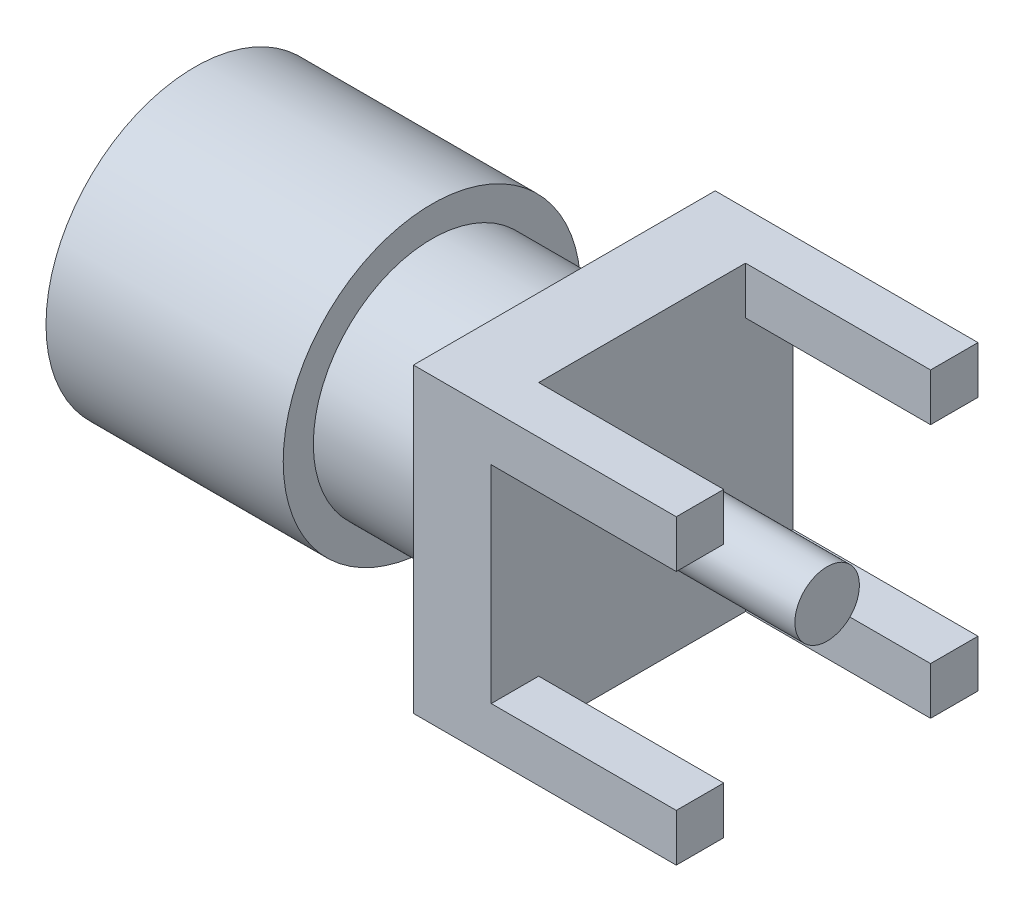
ISO-10303-21;
HEADER;
FILE_DESCRIPTION(('STEP AP214'),'2;1');
FILE_NAME('part.step','',(''),(''),'','','');
FILE_SCHEMA(('AUTOMOTIVE_DESIGN { 1 0 10303 214 1 1 1 1 }'));
ENDSEC;
DATA;
#1=APPLICATION_CONTEXT('core data for automotive mechanical design processes');
#2=APPLICATION_PROTOCOL_DEFINITION('international standard','automotive_design',2000,#1);
#3=PRODUCT_CONTEXT('',#1,'mechanical');
#4=PRODUCT('Part','Part','',(#3));
#5=PRODUCT_RELATED_PRODUCT_CATEGORY('part','',(#4));
#6=PRODUCT_DEFINITION_FORMATION('','',#4);
#7=PRODUCT_DEFINITION_CONTEXT('part definition',#1,'design');
#8=PRODUCT_DEFINITION('design','',#6,#7);
#9=PRODUCT_DEFINITION_SHAPE('','',#8);
#10=(LENGTH_UNIT() NAMED_UNIT(*) SI_UNIT(.MILLI.,.METRE.));
#11=(NAMED_UNIT(*) PLANE_ANGLE_UNIT() SI_UNIT($,.RADIAN.));
#12=(NAMED_UNIT(*) SI_UNIT($,.STERADIAN.) SOLID_ANGLE_UNIT());
#13=UNCERTAINTY_MEASURE_WITH_UNIT(LENGTH_MEASURE(1.E-05),#10,'distance_accuracy_value','');
#14=(GEOMETRIC_REPRESENTATION_CONTEXT(3) GLOBAL_UNCERTAINTY_ASSIGNED_CONTEXT((#13)) GLOBAL_UNIT_ASSIGNED_CONTEXT((#10,
#11,#12)) REPRESENTATION_CONTEXT('',''));
#15=CARTESIAN_POINT('',(0.,0.,0.));
#16=DIRECTION('',(0.,0.,1.));
#17=DIRECTION('',(1.,0.,0.));
#18=AXIS2_PLACEMENT_3D('',#15,#16,#17);
#19=CARTESIAN_POINT('',(0.82,3.18000000000001,-3.18));
#20=DIRECTION('',(1.,0.,0.));
#21=DIRECTION('',(0.,0.,-1.));
#22=AXIS2_PLACEMENT_3D('',#19,#20,#21);
#23=PLANE('',#22);
#24=DIRECTION('',(0.,-1.,0.));
#25=VECTOR('',#24,1.);
#26=CARTESIAN_POINT('',(0.82,-3.18,-2.18));
#27=LINE('',#26,#25);
#28=CARTESIAN_POINT('',(0.82,-2.18,-2.18));
#29=VERTEX_POINT('',#28);
#30=CARTESIAN_POINT('',(0.82,-3.18,-2.18));
#31=VERTEX_POINT('',#30);
#32=EDGE_CURVE('E51',#29,#31,#27,.T.);
#33=ORIENTED_EDGE('',*,*,#32,.F.);
#34=DIRECTION('',(0.,0.,1.));
#35=VECTOR('',#34,1.);
#36=CARTESIAN_POINT('',(0.82,-2.18,-3.18));
#37=LINE('',#36,#35);
#38=CARTESIAN_POINT('',(0.82,-2.18,-3.18));
#39=VERTEX_POINT('',#38);
#40=EDGE_CURVE('E435',#39,#29,#37,.T.);
#41=ORIENTED_EDGE('',*,*,#40,.F.);
#42=DIRECTION('',(0.,1.,0.));
#43=VECTOR('',#42,1.);
#44=CARTESIAN_POINT('',(0.82,3.18000000000001,-3.18));
#45=LINE('',#44,#43);
#46=CARTESIAN_POINT('',(0.82,2.18000000000001,-3.18));
#47=VERTEX_POINT('',#46);
#48=EDGE_CURVE('E168',#39,#47,#45,.T.);
#49=ORIENTED_EDGE('',*,*,#48,.T.);
#50=DIRECTION('',(0.,0.,-1.));
#51=VECTOR('',#50,1.);
#52=CARTESIAN_POINT('',(0.82,2.18000000000001,-3.18));
#53=LINE('',#52,#51);
#54=CARTESIAN_POINT('',(0.82,2.18000000000001,-2.18));
#55=VERTEX_POINT('',#54);
#56=EDGE_CURVE('E201',#55,#47,#53,.T.);
#57=ORIENTED_EDGE('',*,*,#56,.F.);
#58=DIRECTION('',(0.,-1.,0.));
#59=VECTOR('',#58,1.);
#60=CARTESIAN_POINT('',(0.82,3.18000000000001,-2.18));
#61=LINE('',#60,#59);
#62=CARTESIAN_POINT('',(0.82,3.18000000000001,-2.18));
#63=VERTEX_POINT('',#62);
#64=EDGE_CURVE('E196',#63,#55,#61,.T.);
#65=ORIENTED_EDGE('',*,*,#64,.F.);
#66=DIRECTION('',(0.,0.,1.));
#67=VECTOR('',#66,1.);
#68=CARTESIAN_POINT('',(0.82,3.18000000000001,-3.18));
#69=LINE('',#68,#67);
#70=CARTESIAN_POINT('',(0.82,3.18000000000001,2.18));
#71=VERTEX_POINT('',#70);
#72=EDGE_CURVE('E245',#63,#71,#69,.T.);
#73=ORIENTED_EDGE('',*,*,#72,.T.);
#74=DIRECTION('',(0.,1.,0.));
#75=VECTOR('',#74,1.);
#76=CARTESIAN_POINT('',(0.82,3.18000000000001,2.18));
#77=LINE('',#76,#75);
#78=CARTESIAN_POINT('',(0.82,2.18000000000001,2.18));
#79=VERTEX_POINT('',#78);
#80=EDGE_CURVE('E224',#79,#71,#77,.T.);
#81=ORIENTED_EDGE('',*,*,#80,.F.);
#82=DIRECTION('',(0.,0.,-1.));
#83=VECTOR('',#82,1.);
#84=CARTESIAN_POINT('',(0.82,2.18000000000001,3.18));
#85=LINE('',#84,#83);
#86=CARTESIAN_POINT('',(0.82,2.18000000000001,3.18));
#87=VERTEX_POINT('',#86);
#88=EDGE_CURVE('E219',#87,#79,#85,.T.);
#89=ORIENTED_EDGE('',*,*,#88,.F.);
#90=DIRECTION('',(0.,1.,0.));
#91=VECTOR('',#90,1.);
#92=CARTESIAN_POINT('',(0.82,3.18000000000001,3.18));
#93=LINE('',#92,#91);
#94=CARTESIAN_POINT('',(0.82,-2.17999999999999,3.18));
#95=VERTEX_POINT('',#94);
#96=EDGE_CURVE('E37',#95,#87,#93,.T.);
#97=ORIENTED_EDGE('',*,*,#96,.F.);
#98=DIRECTION('',(0.,0.,1.));
#99=VECTOR('',#98,1.);
#100=CARTESIAN_POINT('',(0.82,-2.18,3.18));
#101=LINE('',#100,#99);
#102=CARTESIAN_POINT('',(0.82,-2.18,2.18));
#103=VERTEX_POINT('',#102);
#104=EDGE_CURVE('E171',#103,#95,#101,.T.);
#105=ORIENTED_EDGE('',*,*,#104,.F.);
#106=DIRECTION('',(0.,1.,0.));
#107=VECTOR('',#106,1.);
#108=CARTESIAN_POINT('',(0.82,-3.18,2.18));
#109=LINE('',#108,#107);
#110=CARTESIAN_POINT('',(0.82,-3.18,2.18));
#111=VERTEX_POINT('',#110);
#112=EDGE_CURVE('E169',#111,#103,#109,.T.);
#113=ORIENTED_EDGE('',*,*,#112,.F.);
#114=DIRECTION('',(0.,0.,1.));
#115=VECTOR('',#114,1.);
#116=CARTESIAN_POINT('',(0.82,-3.18,-3.18));
#117=LINE('',#116,#115);
#118=EDGE_CURVE('E11',#31,#111,#117,.T.);
#119=ORIENTED_EDGE('',*,*,#118,.F.);
#120=EDGE_LOOP('',(#33,#41,#49,#57,#65,#73,#81,#89,#97,#105,#113,#119));
#121=FACE_BOUND('',#120,.T.);
#122=CARTESIAN_POINT('',(0.82,0.,0.));
#123=DIRECTION('',(1.,0.,0.));
#124=DIRECTION('',(0.,0.,-1.));
#125=AXIS2_PLACEMENT_3D('',#122,#123,#124);
#126=CIRCLE('',#125,0.68);
#127=CARTESIAN_POINT('',(0.82,0.,-0.68));
#128=VERTEX_POINT('',#127);
#129=EDGE_CURVE('E425',#128,#128,#126,.T.);
#130=ORIENTED_EDGE('',*,*,#129,.F.);
#131=EDGE_LOOP('',(#130));
#132=FACE_BOUND('',#131,.T.);
#133=ADVANCED_FACE('F34',(#121,#132),#23,.T.);
#134=CARTESIAN_POINT('',(-0.82,3.18000000000001,-3.18));
#135=DIRECTION('',(-1.,0.,0.));
#136=DIRECTION('',(0.,0.,1.));
#137=AXIS2_PLACEMENT_3D('',#134,#135,#136);
#138=PLANE('',#137);
#139=DIRECTION('',(0.,0.,1.));
#140=VECTOR('',#139,1.);
#141=CARTESIAN_POINT('',(-0.82,-3.18,-3.18));
#142=LINE('',#141,#140);
#143=CARTESIAN_POINT('',(-0.82,-3.18,-3.18));
#144=VERTEX_POINT('',#143);
#145=CARTESIAN_POINT('',(-0.82,-3.18,3.18));
#146=VERTEX_POINT('',#145);
#147=EDGE_CURVE('E43',#144,#146,#142,.T.);
#148=ORIENTED_EDGE('',*,*,#147,.T.);
#149=DIRECTION('',(0.,-1.,0.));
#150=VECTOR('',#149,1.);
#151=CARTESIAN_POINT('',(-0.82,3.18000000000001,3.18));
#152=LINE('',#151,#150);
#153=CARTESIAN_POINT('',(-0.82,3.18000000000001,3.18));
#154=VERTEX_POINT('',#153);
#155=EDGE_CURVE('E307',#154,#146,#152,.T.);
#156=ORIENTED_EDGE('',*,*,#155,.F.);
#157=DIRECTION('',(0.,0.,1.));
#158=VECTOR('',#157,1.);
#159=CARTESIAN_POINT('',(-0.82,3.18000000000001,-3.18));
#160=LINE('',#159,#158);
#161=CARTESIAN_POINT('',(-0.82,3.18000000000001,-3.18));
#162=VERTEX_POINT('',#161);
#163=EDGE_CURVE('E247',#162,#154,#160,.T.);
#164=ORIENTED_EDGE('',*,*,#163,.F.);
#165=DIRECTION('',(0.,-1.,0.));
#166=VECTOR('',#165,1.);
#167=CARTESIAN_POINT('',(-0.82,3.18000000000001,-3.18));
#168=LINE('',#167,#166);
#169=EDGE_CURVE('E294',#162,#144,#168,.T.);
#170=ORIENTED_EDGE('',*,*,#169,.T.);
#171=EDGE_LOOP('',(#148,#156,#164,#170));
#172=FACE_BOUND('',#171,.T.);
#173=CARTESIAN_POINT('',(-0.82,0.,0.));
#174=DIRECTION('',(-1.,0.,0.));
#175=DIRECTION('',(0.,0.,1.));
#176=AXIS2_PLACEMENT_3D('',#173,#174,#175);
#177=CIRCLE('',#176,2.5);
#178=CARTESIAN_POINT('',(-0.82,0.,2.5));
#179=VERTEX_POINT('',#178);
#180=EDGE_CURVE('E322',#179,#179,#177,.T.);
#181=ORIENTED_EDGE('',*,*,#180,.F.);
#182=EDGE_LOOP('',(#181));
#183=FACE_BOUND('',#182,.T.);
#184=ADVANCED_FACE('F305',(#172,#183),#138,.T.);
#185=CARTESIAN_POINT('',(-0.82,-3.18,-3.18));
#186=DIRECTION('',(0.,-1.,0.));
#187=DIRECTION('',(0.,0.,-1.));
#188=AXIS2_PLACEMENT_3D('',#185,#186,#187);
#189=PLANE('',#188);
#190=DIRECTION('',(1.,0.,0.));
#191=VECTOR('',#190,1.);
#192=CARTESIAN_POINT('',(-0.82,-3.18,-3.18));
#193=LINE('',#192,#191);
#194=CARTESIAN_POINT('',(4.72,-3.18,-3.18));
#195=VERTEX_POINT('',#194);
#196=EDGE_CURVE('E248',#144,#195,#193,.T.);
#197=ORIENTED_EDGE('',*,*,#196,.T.);
#198=DIRECTION('',(0.,0.,-1.));
#199=VECTOR('',#198,1.);
#200=CARTESIAN_POINT('',(4.72,-3.18,-3.18));
#201=LINE('',#200,#199);
#202=CARTESIAN_POINT('',(4.72,-3.18,-2.18));
#203=VERTEX_POINT('',#202);
#204=EDGE_CURVE('E162',#203,#195,#201,.T.);
#205=ORIENTED_EDGE('',*,*,#204,.F.);
#206=DIRECTION('',(-1.,0.,0.));
#207=VECTOR('',#206,1.);
#208=CARTESIAN_POINT('',(4.72,-3.18,-2.18));
#209=LINE('',#208,#207);
#210=EDGE_CURVE('E173',#203,#31,#209,.T.);
#211=ORIENTED_EDGE('',*,*,#210,.T.);
#212=ORIENTED_EDGE('',*,*,#118,.T.);
#213=DIRECTION('',(-1.,0.,0.));
#214=VECTOR('',#213,1.);
#215=CARTESIAN_POINT('',(4.72,-3.18,2.18));
#216=LINE('',#215,#214);
#217=CARTESIAN_POINT('',(4.72,-3.18,2.18));
#218=VERTEX_POINT('',#217);
#219=EDGE_CURVE('E193',#218,#111,#216,.T.);
#220=ORIENTED_EDGE('',*,*,#219,.F.);
#221=DIRECTION('',(0.,0.,-1.));
#222=VECTOR('',#221,1.);
#223=CARTESIAN_POINT('',(4.72,-3.18,3.18));
#224=LINE('',#223,#222);
#225=CARTESIAN_POINT('',(4.72,-3.18,3.18));
#226=VERTEX_POINT('',#225);
#227=EDGE_CURVE('E180',#226,#218,#224,.T.);
#228=ORIENTED_EDGE('',*,*,#227,.F.);
#229=DIRECTION('',(1.,0.,0.));
#230=VECTOR('',#229,1.);
#231=CARTESIAN_POINT('',(-0.82,-3.18,3.18));
#232=LINE('',#231,#230);
#233=EDGE_CURVE('E298',#146,#226,#232,.T.);
#234=ORIENTED_EDGE('',*,*,#233,.F.);
#235=ORIENTED_EDGE('',*,*,#147,.F.);
#236=EDGE_LOOP('',(#197,#205,#211,#212,#220,#228,#234,#235));
#237=FACE_BOUND('',#236,.T.);
#238=ADVANCED_FACE('F317',(#237),#189,.T.);
#239=CARTESIAN_POINT('',(-0.82,3.18000000000001,-3.18));
#240=DIRECTION('',(0.,1.,0.));
#241=DIRECTION('',(0.,0.,1.));
#242=AXIS2_PLACEMENT_3D('',#239,#240,#241);
#243=PLANE('',#242);
#244=ORIENTED_EDGE('',*,*,#163,.T.);
#245=DIRECTION('',(-1.,0.,0.));
#246=VECTOR('',#245,1.);
#247=CARTESIAN_POINT('',(-0.82,3.18000000000001,3.18));
#248=LINE('',#247,#246);
#249=CARTESIAN_POINT('',(4.72,3.18000000000001,3.18));
#250=VERTEX_POINT('',#249);
#251=EDGE_CURVE('E315',#250,#154,#248,.T.);
#252=ORIENTED_EDGE('',*,*,#251,.F.);
#253=DIRECTION('',(0.,0.,1.));
#254=VECTOR('',#253,1.);
#255=CARTESIAN_POINT('',(4.72,3.18000000000001,3.18));
#256=LINE('',#255,#254);
#257=CARTESIAN_POINT('',(4.72,3.18000000000001,2.18));
#258=VERTEX_POINT('',#257);
#259=EDGE_CURVE('E228',#258,#250,#256,.T.);
#260=ORIENTED_EDGE('',*,*,#259,.F.);
#261=DIRECTION('',(-1.,0.,0.));
#262=VECTOR('',#261,1.);
#263=CARTESIAN_POINT('',(4.72,3.18000000000001,2.18));
#264=LINE('',#263,#262);
#265=EDGE_CURVE('E231',#258,#71,#264,.T.);
#266=ORIENTED_EDGE('',*,*,#265,.T.);
#267=ORIENTED_EDGE('',*,*,#72,.F.);
#268=DIRECTION('',(-1.,0.,0.));
#269=VECTOR('',#268,1.);
#270=CARTESIAN_POINT('',(4.72,3.18000000000001,-2.18));
#271=LINE('',#270,#269);
#272=CARTESIAN_POINT('',(4.72,3.18000000000001,-2.18));
#273=VERTEX_POINT('',#272);
#274=EDGE_CURVE('E216',#273,#63,#271,.T.);
#275=ORIENTED_EDGE('',*,*,#274,.F.);
#276=DIRECTION('',(0.,0.,1.));
#277=VECTOR('',#276,1.);
#278=CARTESIAN_POINT('',(4.72,3.18000000000001,-3.18));
#279=LINE('',#278,#277);
#280=CARTESIAN_POINT('',(4.72,3.18000000000001,-3.18));
#281=VERTEX_POINT('',#280);
#282=EDGE_CURVE('E200',#281,#273,#279,.T.);
#283=ORIENTED_EDGE('',*,*,#282,.F.);
#284=DIRECTION('',(-1.,0.,0.));
#285=VECTOR('',#284,1.);
#286=CARTESIAN_POINT('',(-0.82,3.18000000000001,-3.18));
#287=LINE('',#286,#285);
#288=EDGE_CURVE('E291',#281,#162,#287,.T.);
#289=ORIENTED_EDGE('',*,*,#288,.T.);
#290=EDGE_LOOP('',(#244,#252,#260,#266,#267,#275,#283,#289));
#291=FACE_BOUND('',#290,.T.);
#292=ADVANCED_FACE('F278',(#291),#243,.T.);
#293=CARTESIAN_POINT('',(0.82,-3.18,-3.18));
#294=DIRECTION('',(0.,0.,1.));
#295=DIRECTION('',(1.,0.,0.));
#296=AXIS2_PLACEMENT_3D('',#293,#294,#295);
#297=PLANE('',#296);
#298=ORIENTED_EDGE('',*,*,#48,.F.);
#299=DIRECTION('',(-1.,0.,0.));
#300=VECTOR('',#299,1.);
#301=CARTESIAN_POINT('',(4.72,-2.18,-3.18));
#302=LINE('',#301,#300);
#303=CARTESIAN_POINT('',(4.72,-2.18,-3.18));
#304=VERTEX_POINT('',#303);
#305=EDGE_CURVE('E150',#304,#39,#302,.T.);
#306=ORIENTED_EDGE('',*,*,#305,.F.);
#307=DIRECTION('',(0.,1.,0.));
#308=VECTOR('',#307,1.);
#309=CARTESIAN_POINT('',(4.72,-3.18,-3.18));
#310=LINE('',#309,#308);
#311=EDGE_CURVE('E156',#195,#304,#310,.T.);
#312=ORIENTED_EDGE('',*,*,#311,.F.);
#313=ORIENTED_EDGE('',*,*,#196,.F.);
#314=ORIENTED_EDGE('',*,*,#169,.F.);
#315=ORIENTED_EDGE('',*,*,#288,.F.);
#316=DIRECTION('',(0.,1.,0.));
#317=VECTOR('',#316,1.);
#318=CARTESIAN_POINT('',(4.72,3.18000000000001,-3.18));
#319=LINE('',#318,#317);
#320=CARTESIAN_POINT('',(4.72,2.18000000000001,-3.18));
#321=VERTEX_POINT('',#320);
#322=EDGE_CURVE('E197',#321,#281,#319,.T.);
#323=ORIENTED_EDGE('',*,*,#322,.F.);
#324=DIRECTION('',(-1.,0.,0.));
#325=VECTOR('',#324,1.);
#326=CARTESIAN_POINT('',(4.72,2.18000000000001,-3.18));
#327=LINE('',#326,#325);
#328=EDGE_CURVE('E207',#321,#47,#327,.T.);
#329=ORIENTED_EDGE('',*,*,#328,.T.);
#330=EDGE_LOOP('',(#298,#306,#312,#313,#314,#315,#323,#329));
#331=FACE_BOUND('',#330,.T.);
#332=ADVANCED_FACE('F166',(#331),#297,.F.);
#333=CARTESIAN_POINT('',(0.82,-3.18,3.18));
#334=DIRECTION('',(0.,0.,1.));
#335=DIRECTION('',(1.,0.,0.));
#336=AXIS2_PLACEMENT_3D('',#333,#334,#335);
#337=PLANE('',#336);
#338=ORIENTED_EDGE('',*,*,#233,.T.);
#339=DIRECTION('',(0.,-1.,0.));
#340=VECTOR('',#339,1.);
#341=CARTESIAN_POINT('',(4.72,-3.18,3.18));
#342=LINE('',#341,#340);
#343=CARTESIAN_POINT('',(4.72,-2.18,3.18));
#344=VERTEX_POINT('',#343);
#345=EDGE_CURVE('E177',#344,#226,#342,.T.);
#346=ORIENTED_EDGE('',*,*,#345,.F.);
#347=DIRECTION('',(-1.,0.,0.));
#348=VECTOR('',#347,1.);
#349=CARTESIAN_POINT('',(4.72,-2.18,3.18));
#350=LINE('',#349,#348);
#351=EDGE_CURVE('E185',#344,#95,#350,.T.);
#352=ORIENTED_EDGE('',*,*,#351,.T.);
#353=ORIENTED_EDGE('',*,*,#96,.T.);
#354=DIRECTION('',(-1.,0.,0.));
#355=VECTOR('',#354,1.);
#356=CARTESIAN_POINT('',(4.72,2.18000000000001,3.18));
#357=LINE('',#356,#355);
#358=CARTESIAN_POINT('',(4.72,2.18000000000001,3.18));
#359=VERTEX_POINT('',#358);
#360=EDGE_CURVE('E256',#359,#87,#357,.T.);
#361=ORIENTED_EDGE('',*,*,#360,.F.);
#362=DIRECTION('',(0.,-1.,0.));
#363=VECTOR('',#362,1.);
#364=CARTESIAN_POINT('',(4.72,3.18000000000001,3.18));
#365=LINE('',#364,#363);
#366=EDGE_CURVE('E220',#250,#359,#365,.T.);
#367=ORIENTED_EDGE('',*,*,#366,.F.);
#368=ORIENTED_EDGE('',*,*,#251,.T.);
#369=ORIENTED_EDGE('',*,*,#155,.T.);
#370=EDGE_LOOP('',(#338,#346,#352,#353,#361,#367,#368,#369));
#371=FACE_BOUND('',#370,.T.);
#372=ADVANCED_FACE('F311',(#371),#337,.T.);
#373=CARTESIAN_POINT('',(-3.61,0.,0.));
#374=DIRECTION('',(1.,0.,0.));
#375=DIRECTION('',(0.,0.,-1.));
#376=AXIS2_PLACEMENT_3D('',#373,#374,#375);
#377=CYLINDRICAL_SURFACE('',#376,2.5);
#378=CARTESIAN_POINT('',(-3.61,0.,0.));
#379=DIRECTION('',(-1.,0.,0.));
#380=DIRECTION('',(0.,0.,1.));
#381=AXIS2_PLACEMENT_3D('',#378,#379,#380);
#382=CIRCLE('',#381,2.5);
#383=CARTESIAN_POINT('',(-3.61,0.,2.5));
#384=VERTEX_POINT('',#383);
#385=EDGE_CURVE('E325',#384,#384,#382,.T.);
#386=ORIENTED_EDGE('',*,*,#385,.F.);
#387=EDGE_LOOP('',(#386));
#388=FACE_BOUND('',#387,.T.);
#389=ORIENTED_EDGE('',*,*,#180,.T.);
#390=EDGE_LOOP('',(#389));
#391=FACE_BOUND('',#390,.T.);
#392=ADVANCED_FACE('F341',(#388,#391),#377,.T.);
#393=CARTESIAN_POINT('',(-3.61,0.,0.));
#394=DIRECTION('',(-1.,0.,0.));
#395=DIRECTION('',(0.,0.,1.));
#396=AXIS2_PLACEMENT_3D('',#393,#394,#395);
#397=PLANE('',#396);
#398=CARTESIAN_POINT('',(-3.61,0.,0.));
#399=DIRECTION('',(-1.,0.,0.));
#400=DIRECTION('',(0.,0.,1.));
#401=AXIS2_PLACEMENT_3D('',#398,#399,#400);
#402=CIRCLE('',#401,3.135);
#403=CARTESIAN_POINT('',(-3.61,0.,3.135));
#404=VERTEX_POINT('',#403);
#405=EDGE_CURVE('E258',#404,#404,#402,.T.);
#406=ORIENTED_EDGE('',*,*,#405,.F.);
#407=EDGE_LOOP('',(#406));
#408=FACE_BOUND('',#407,.T.);
#409=ORIENTED_EDGE('',*,*,#385,.T.);
#410=EDGE_LOOP('',(#409));
#411=FACE_BOUND('',#410,.T.);
#412=ADVANCED_FACE('F335',(#408,#411),#397,.F.);
#413=CARTESIAN_POINT('',(-8.61,0.,0.));
#414=DIRECTION('',(1.,0.,0.));
#415=DIRECTION('',(0.,0.,-1.));
#416=AXIS2_PLACEMENT_3D('',#413,#414,#415);
#417=CYLINDRICAL_SURFACE('',#416,3.135);
#418=CARTESIAN_POINT('',(-8.61,0.,0.));
#419=DIRECTION('',(-1.,0.,0.));
#420=DIRECTION('',(0.,0.,1.));
#421=AXIS2_PLACEMENT_3D('',#418,#419,#420);
#422=CIRCLE('',#421,3.135);
#423=CARTESIAN_POINT('',(-8.61,0.,3.135));
#424=VERTEX_POINT('',#423);
#425=EDGE_CURVE('E262',#424,#424,#422,.T.);
#426=ORIENTED_EDGE('',*,*,#425,.F.);
#427=EDGE_LOOP('',(#426));
#428=FACE_BOUND('',#427,.T.);
#429=ORIENTED_EDGE('',*,*,#405,.T.);
#430=EDGE_LOOP('',(#429));
#431=FACE_BOUND('',#430,.T.);
#432=ADVANCED_FACE('F332',(#428,#431),#417,.T.);
#433=CARTESIAN_POINT('',(-8.61,0.,0.));
#434=DIRECTION('',(-1.,0.,0.));
#435=DIRECTION('',(0.,0.,1.));
#436=AXIS2_PLACEMENT_3D('',#433,#434,#435);
#437=PLANE('',#436);
#438=CARTESIAN_POINT('',(-8.61,0.,0.));
#439=DIRECTION('',(-1.,0.,0.));
#440=DIRECTION('',(0.,0.,1.));
#441=AXIS2_PLACEMENT_3D('',#438,#439,#440);
#442=CIRCLE('',#441,2.245);
#443=CARTESIAN_POINT('',(-8.61,0.,2.245));
#444=VERTEX_POINT('',#443);
#445=EDGE_CURVE('E426',#444,#444,#442,.T.);
#446=ORIENTED_EDGE('',*,*,#445,.F.);
#447=EDGE_LOOP('',(#446));
#448=FACE_BOUND('',#447,.T.);
#449=ORIENTED_EDGE('',*,*,#425,.T.);
#450=EDGE_LOOP('',(#449));
#451=FACE_BOUND('',#450,.T.);
#452=ADVANCED_FACE('F330',(#448,#451),#437,.T.);
#453=CARTESIAN_POINT('',(4.72,2.18000000000001,3.18));
#454=DIRECTION('',(0.,1.,0.));
#455=DIRECTION('',(0.,0.,1.));
#456=AXIS2_PLACEMENT_3D('',#453,#454,#455);
#457=PLANE('',#456);
#458=ORIENTED_EDGE('',*,*,#88,.T.);
#459=DIRECTION('',(-1.,0.,0.));
#460=VECTOR('',#459,1.);
#461=CARTESIAN_POINT('',(4.72,2.18000000000001,2.18));
#462=LINE('',#461,#460);
#463=CARTESIAN_POINT('',(4.72,2.18000000000001,2.18));
#464=VERTEX_POINT('',#463);
#465=EDGE_CURVE('E234',#464,#79,#462,.T.);
#466=ORIENTED_EDGE('',*,*,#465,.F.);
#467=DIRECTION('',(0.,0.,-1.));
#468=VECTOR('',#467,1.);
#469=CARTESIAN_POINT('',(4.72,2.18000000000001,3.18));
#470=LINE('',#469,#468);
#471=EDGE_CURVE('E223',#359,#464,#470,.T.);
#472=ORIENTED_EDGE('',*,*,#471,.F.);
#473=ORIENTED_EDGE('',*,*,#360,.T.);
#474=EDGE_LOOP('',(#458,#466,#472,#473));
#475=FACE_BOUND('',#474,.T.);
#476=ADVANCED_FACE('F270',(#475),#457,.F.);
#477=CARTESIAN_POINT('',(4.72,3.18000000000001,2.18));
#478=DIRECTION('',(0.,0.,1.));
#479=DIRECTION('',(0.,-1.,0.));
#480=AXIS2_PLACEMENT_3D('',#477,#478,#479);
#481=PLANE('',#480);
#482=ORIENTED_EDGE('',*,*,#80,.T.);
#483=ORIENTED_EDGE('',*,*,#265,.F.);
#484=DIRECTION('',(0.,1.,0.));
#485=VECTOR('',#484,1.);
#486=CARTESIAN_POINT('',(4.72,3.18000000000001,2.18));
#487=LINE('',#486,#485);
#488=EDGE_CURVE('E226',#464,#258,#487,.T.);
#489=ORIENTED_EDGE('',*,*,#488,.F.);
#490=ORIENTED_EDGE('',*,*,#465,.T.);
#491=EDGE_LOOP('',(#482,#483,#489,#490));
#492=FACE_BOUND('',#491,.T.);
#493=ADVANCED_FACE('F268',(#492),#481,.F.);
#494=CARTESIAN_POINT('',(4.72,2.18000000000001,3.18));
#495=DIRECTION('',(1.,0.,0.));
#496=DIRECTION('',(0.,0.,-1.));
#497=AXIS2_PLACEMENT_3D('',#494,#495,#496);
#498=PLANE('',#497);
#499=ORIENTED_EDGE('',*,*,#366,.T.);
#500=ORIENTED_EDGE('',*,*,#471,.T.);
#501=ORIENTED_EDGE('',*,*,#488,.T.);
#502=ORIENTED_EDGE('',*,*,#259,.T.);
#503=EDGE_LOOP('',(#499,#500,#501,#502));
#504=FACE_BOUND('',#503,.T.);
#505=ADVANCED_FACE('F373',(#504),#498,.T.);
#506=CARTESIAN_POINT('',(4.72,3.18000000000001,-2.18));
#507=DIRECTION('',(0.,0.,-1.));
#508=DIRECTION('',(0.,1.,0.));
#509=AXIS2_PLACEMENT_3D('',#506,#507,#508);
#510=PLANE('',#509);
#511=ORIENTED_EDGE('',*,*,#64,.T.);
#512=DIRECTION('',(-1.,0.,0.));
#513=VECTOR('',#512,1.);
#514=CARTESIAN_POINT('',(4.72,2.18000000000001,-2.18));
#515=LINE('',#514,#513);
#516=CARTESIAN_POINT('',(4.72,2.18000000000001,-2.18));
#517=VERTEX_POINT('',#516);
#518=EDGE_CURVE('E213',#517,#55,#515,.T.);
#519=ORIENTED_EDGE('',*,*,#518,.F.);
#520=DIRECTION('',(0.,-1.,0.));
#521=VECTOR('',#520,1.);
#522=CARTESIAN_POINT('',(4.72,3.18000000000001,-2.18));
#523=LINE('',#522,#521);
#524=EDGE_CURVE('E203',#273,#517,#523,.T.);
#525=ORIENTED_EDGE('',*,*,#524,.F.);
#526=ORIENTED_EDGE('',*,*,#274,.T.);
#527=EDGE_LOOP('',(#511,#519,#525,#526));
#528=FACE_BOUND('',#527,.T.);
#529=ADVANCED_FACE('F283',(#528),#510,.F.);
#530=CARTESIAN_POINT('',(4.72,2.18000000000001,-3.18));
#531=DIRECTION('',(0.,1.,0.));
#532=DIRECTION('',(0.,0.,1.));
#533=AXIS2_PLACEMENT_3D('',#530,#531,#532);
#534=PLANE('',#533);
#535=ORIENTED_EDGE('',*,*,#56,.T.);
#536=ORIENTED_EDGE('',*,*,#328,.F.);
#537=DIRECTION('',(0.,0.,-1.));
#538=VECTOR('',#537,1.);
#539=CARTESIAN_POINT('',(4.72,2.18000000000001,-3.18));
#540=LINE('',#539,#538);
#541=EDGE_CURVE('E205',#517,#321,#540,.T.);
#542=ORIENTED_EDGE('',*,*,#541,.F.);
#543=ORIENTED_EDGE('',*,*,#518,.T.);
#544=EDGE_LOOP('',(#535,#536,#542,#543));
#545=FACE_BOUND('',#544,.T.);
#546=ADVANCED_FACE('F379',(#545),#534,.F.);
#547=CARTESIAN_POINT('',(4.72,2.18000000000001,-3.18));
#548=DIRECTION('',(-1.,0.,0.));
#549=DIRECTION('',(0.,0.,1.));
#550=AXIS2_PLACEMENT_3D('',#547,#548,#549);
#551=PLANE('',#550);
#552=ORIENTED_EDGE('',*,*,#322,.T.);
#553=ORIENTED_EDGE('',*,*,#282,.T.);
#554=ORIENTED_EDGE('',*,*,#524,.T.);
#555=ORIENTED_EDGE('',*,*,#541,.T.);
#556=EDGE_LOOP('',(#552,#553,#554,#555));
#557=FACE_BOUND('',#556,.T.);
#558=ADVANCED_FACE('F287',(#557),#551,.F.);
#559=CARTESIAN_POINT('',(4.72,-3.18,2.18));
#560=DIRECTION('',(0.,0.,1.));
#561=DIRECTION('',(1.,0.,0.));
#562=AXIS2_PLACEMENT_3D('',#559,#560,#561);
#563=PLANE('',#562);
#564=ORIENTED_EDGE('',*,*,#112,.T.);
#565=DIRECTION('',(-1.,0.,0.));
#566=VECTOR('',#565,1.);
#567=CARTESIAN_POINT('',(4.72,-2.18,2.18));
#568=LINE('',#567,#566);
#569=CARTESIAN_POINT('',(4.72,-2.18,2.18));
#570=VERTEX_POINT('',#569);
#571=EDGE_CURVE('E190',#570,#103,#568,.T.);
#572=ORIENTED_EDGE('',*,*,#571,.F.);
#573=DIRECTION('',(0.,1.,0.));
#574=VECTOR('',#573,1.);
#575=CARTESIAN_POINT('',(4.72,-3.18,2.18));
#576=LINE('',#575,#574);
#577=EDGE_CURVE('E182',#218,#570,#576,.T.);
#578=ORIENTED_EDGE('',*,*,#577,.F.);
#579=ORIENTED_EDGE('',*,*,#219,.T.);
#580=EDGE_LOOP('',(#564,#572,#578,#579));
#581=FACE_BOUND('',#580,.T.);
#582=ADVANCED_FACE('F385',(#581),#563,.F.);
#583=CARTESIAN_POINT('',(4.72,-2.18,3.18));
#584=DIRECTION('',(0.,-1.,0.));
#585=DIRECTION('',(0.,0.,-1.));
#586=AXIS2_PLACEMENT_3D('',#583,#584,#585);
#587=PLANE('',#586);
#588=ORIENTED_EDGE('',*,*,#104,.T.);
#589=ORIENTED_EDGE('',*,*,#351,.F.);
#590=DIRECTION('',(0.,0.,1.));
#591=VECTOR('',#590,1.);
#592=CARTESIAN_POINT('',(4.72,-2.18,3.18));
#593=LINE('',#592,#591);
#594=EDGE_CURVE('E184',#570,#344,#593,.T.);
#595=ORIENTED_EDGE('',*,*,#594,.F.);
#596=ORIENTED_EDGE('',*,*,#571,.T.);
#597=EDGE_LOOP('',(#588,#589,#595,#596));
#598=FACE_BOUND('',#597,.T.);
#599=ADVANCED_FACE('F388',(#598),#587,.F.);
#600=CARTESIAN_POINT('',(4.72,-2.18,3.18));
#601=DIRECTION('',(-1.,0.,0.));
#602=DIRECTION('',(0.,0.,1.));
#603=AXIS2_PLACEMENT_3D('',#600,#601,#602);
#604=PLANE('',#603);
#605=ORIENTED_EDGE('',*,*,#345,.T.);
#606=ORIENTED_EDGE('',*,*,#227,.T.);
#607=ORIENTED_EDGE('',*,*,#577,.T.);
#608=ORIENTED_EDGE('',*,*,#594,.T.);
#609=EDGE_LOOP('',(#605,#606,#607,#608));
#610=FACE_BOUND('',#609,.T.);
#611=ADVANCED_FACE('F392',(#610),#604,.F.);
#612=CARTESIAN_POINT('',(4.72,-2.18,-3.18));
#613=DIRECTION('',(0.,-1.,0.));
#614=DIRECTION('',(0.,0.,-1.));
#615=AXIS2_PLACEMENT_3D('',#612,#613,#614);
#616=PLANE('',#615);
#617=ORIENTED_EDGE('',*,*,#40,.T.);
#618=DIRECTION('',(-1.,0.,0.));
#619=VECTOR('',#618,1.);
#620=CARTESIAN_POINT('',(4.72,-2.18,-2.18));
#621=LINE('',#620,#619);
#622=CARTESIAN_POINT('',(4.72,-2.18,-2.18));
#623=VERTEX_POINT('',#622);
#624=EDGE_CURVE('E152',#623,#29,#621,.T.);
#625=ORIENTED_EDGE('',*,*,#624,.F.);
#626=DIRECTION('',(0.,0.,1.));
#627=VECTOR('',#626,1.);
#628=CARTESIAN_POINT('',(4.72,-2.18,-3.18));
#629=LINE('',#628,#627);
#630=EDGE_CURVE('E146',#304,#623,#629,.T.);
#631=ORIENTED_EDGE('',*,*,#630,.F.);
#632=ORIENTED_EDGE('',*,*,#305,.T.);
#633=EDGE_LOOP('',(#617,#625,#631,#632));
#634=FACE_BOUND('',#633,.T.);
#635=ADVANCED_FACE('F148',(#634),#616,.F.);
#636=CARTESIAN_POINT('',(4.72,-3.18,-2.18));
#637=DIRECTION('',(0.,0.,-1.));
#638=DIRECTION('',(-1.,0.,0.));
#639=AXIS2_PLACEMENT_3D('',#636,#637,#638);
#640=PLANE('',#639);
#641=ORIENTED_EDGE('',*,*,#32,.T.);
#642=ORIENTED_EDGE('',*,*,#210,.F.);
#643=DIRECTION('',(0.,-1.,0.));
#644=VECTOR('',#643,1.);
#645=CARTESIAN_POINT('',(4.72,-3.18,-2.18));
#646=LINE('',#645,#644);
#647=EDGE_CURVE('E155',#623,#203,#646,.T.);
#648=ORIENTED_EDGE('',*,*,#647,.F.);
#649=ORIENTED_EDGE('',*,*,#624,.T.);
#650=EDGE_LOOP('',(#641,#642,#648,#649));
#651=FACE_BOUND('',#650,.T.);
#652=ADVANCED_FACE('F399',(#651),#640,.F.);
#653=CARTESIAN_POINT('',(4.72,-2.18,-3.18));
#654=DIRECTION('',(1.,0.,0.));
#655=DIRECTION('',(0.,0.,-1.));
#656=AXIS2_PLACEMENT_3D('',#653,#654,#655);
#657=PLANE('',#656);
#658=ORIENTED_EDGE('',*,*,#311,.T.);
#659=ORIENTED_EDGE('',*,*,#630,.T.);
#660=ORIENTED_EDGE('',*,*,#647,.T.);
#661=ORIENTED_EDGE('',*,*,#204,.T.);
#662=EDGE_LOOP('',(#658,#659,#660,#661));
#663=FACE_BOUND('',#662,.T.);
#664=ADVANCED_FACE('F160',(#663),#657,.T.);
#665=CARTESIAN_POINT('',(4.72,0.,0.));
#666=DIRECTION('',(-1.,0.,0.));
#667=DIRECTION('',(0.,0.,1.));
#668=AXIS2_PLACEMENT_3D('',#665,#666,#667);
#669=CYLINDRICAL_SURFACE('',#668,0.68);
#670=CARTESIAN_POINT('',(4.72,0.,0.));
#671=DIRECTION('',(1.,0.,0.));
#672=DIRECTION('',(0.,0.,-1.));
#673=AXIS2_PLACEMENT_3D('',#670,#671,#672);
#674=CIRCLE('',#673,0.68);
#675=CARTESIAN_POINT('',(4.72,0.,-0.68));
#676=VERTEX_POINT('',#675);
#677=EDGE_CURVE('E429',#676,#676,#674,.T.);
#678=ORIENTED_EDGE('',*,*,#677,.F.);
#679=EDGE_LOOP('',(#678));
#680=FACE_BOUND('',#679,.T.);
#681=ORIENTED_EDGE('',*,*,#129,.T.);
#682=EDGE_LOOP('',(#681));
#683=FACE_BOUND('',#682,.T.);
#684=ADVANCED_FACE('F405',(#680,#683),#669,.T.);
#685=CARTESIAN_POINT('',(4.72,0.,0.));
#686=DIRECTION('',(1.,0.,0.));
#687=DIRECTION('',(0.,0.,-1.));
#688=AXIS2_PLACEMENT_3D('',#685,#686,#687);
#689=PLANE('',#688);
#690=ORIENTED_EDGE('',*,*,#677,.T.);
#691=EDGE_LOOP('',(#690));
#692=FACE_BOUND('',#691,.T.);
#693=ADVANCED_FACE('F408',(#692),#689,.T.);
#694=CARTESIAN_POINT('',(-6.61,0.,0.));
#695=DIRECTION('',(-1.,0.,0.));
#696=DIRECTION('',(0.,0.,1.));
#697=AXIS2_PLACEMENT_3D('',#694,#695,#696);
#698=CYLINDRICAL_SURFACE('',#697,2.245);
#699=CARTESIAN_POINT('',(-6.61,0.,0.));
#700=DIRECTION('',(-1.,0.,0.));
#701=DIRECTION('',(0.,0.,1.));
#702=AXIS2_PLACEMENT_3D('',#699,#700,#701);
#703=CIRCLE('',#702,2.245);
#704=CARTESIAN_POINT('',(-6.61,0.,2.245));
#705=VERTEX_POINT('',#704);
#706=EDGE_CURVE('E424',#705,#705,#703,.T.);
#707=ORIENTED_EDGE('',*,*,#706,.F.);
#708=EDGE_LOOP('',(#707));
#709=FACE_BOUND('',#708,.T.);
#710=ORIENTED_EDGE('',*,*,#445,.T.);
#711=EDGE_LOOP('',(#710));
#712=FACE_BOUND('',#711,.T.);
#713=ADVANCED_FACE('F412',(#709,#712),#698,.F.);
#714=CARTESIAN_POINT('',(-6.61,0.,0.));
#715=DIRECTION('',(-1.,0.,0.));
#716=DIRECTION('',(0.,0.,1.));
#717=AXIS2_PLACEMENT_3D('',#714,#715,#716);
#718=PLANE('',#717);
#719=ORIENTED_EDGE('',*,*,#706,.T.);
#720=EDGE_LOOP('',(#719));
#721=FACE_BOUND('',#720,.T.);
#722=ADVANCED_FACE('F416',(#721),#718,.T.);
#723=CLOSED_SHELL('',(#133,#184,#238,#292,#332,#372,#392,#412,#432,#452,#476,#493,#505,#529,
#546,#558,#582,#599,#611,#635,#652,#664,#684,#693,#713,#722));
#724=MANIFOLD_SOLID_BREP('B2',#723);
#725=ADVANCED_BREP_SHAPE_REPRESENTATION('',(#18,#724),#14);
#726=SHAPE_DEFINITION_REPRESENTATION(#9,#725);
ENDSEC;
END-ISO-10303-21;
